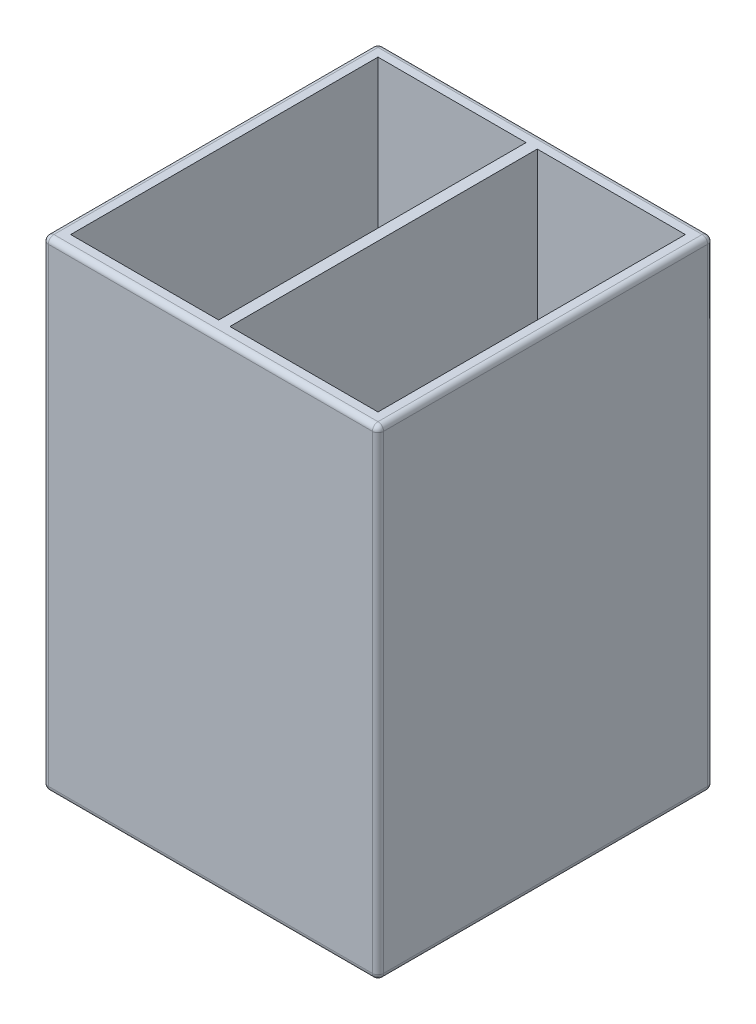
ISO-10303-21;
HEADER;
FILE_DESCRIPTION(('STEP AP214'),'2;1');
FILE_NAME('part.step','',(''),(''),'','','');
FILE_SCHEMA(('AUTOMOTIVE_DESIGN { 1 0 10303 214 1 1 1 1 }'));
ENDSEC;
DATA;
#1=APPLICATION_CONTEXT('core data for automotive mechanical design processes');
#2=APPLICATION_PROTOCOL_DEFINITION('international standard','automotive_design',2000,#1);
#3=PRODUCT_CONTEXT('',#1,'mechanical');
#4=PRODUCT('Part','Part','',(#3));
#5=PRODUCT_RELATED_PRODUCT_CATEGORY('part','',(#4));
#6=PRODUCT_DEFINITION_FORMATION('','',#4);
#7=PRODUCT_DEFINITION_CONTEXT('part definition',#1,'design');
#8=PRODUCT_DEFINITION('design','',#6,#7);
#9=PRODUCT_DEFINITION_SHAPE('','',#8);
#10=(LENGTH_UNIT() NAMED_UNIT(*) SI_UNIT(.MILLI.,.METRE.));
#11=(NAMED_UNIT(*) PLANE_ANGLE_UNIT() SI_UNIT($,.RADIAN.));
#12=(NAMED_UNIT(*) SI_UNIT($,.STERADIAN.) SOLID_ANGLE_UNIT());
#13=UNCERTAINTY_MEASURE_WITH_UNIT(LENGTH_MEASURE(1.E-05),#10,'distance_accuracy_value','');
#14=(GEOMETRIC_REPRESENTATION_CONTEXT(3) GLOBAL_UNCERTAINTY_ASSIGNED_CONTEXT((#13)) GLOBAL_UNIT_ASSIGNED_CONTEXT((#10,
#11,#12)) REPRESENTATION_CONTEXT('',''));
#15=CARTESIAN_POINT('',(0.,0.,0.));
#16=DIRECTION('',(0.,0.,1.));
#17=DIRECTION('',(1.,0.,0.));
#18=AXIS2_PLACEMENT_3D('',#15,#16,#17);
#19=CARTESIAN_POINT('',(-164.000159601933,109.22,-4.27528919135131));
#20=DIRECTION('',(1.,0.,0.));
#21=DIRECTION('',(0.,0.,-1.));
#22=AXIS2_PLACEMENT_3D('',#19,#20,#21);
#23=PLANE('',#22);
#24=DIRECTION('',(0.,0.,1.));
#25=VECTOR('',#24,1.);
#26=CARTESIAN_POINT('',(-164.000159601933,107.95,-4.27528919135131));
#27=LINE('',#26,#25);
#28=CARTESIAN_POINT('',(-164.000159601933,107.95,70.6547108086487));
#29=VERTEX_POINT('',#28);
#30=CARTESIAN_POINT('',(-164.000159601933,107.95,-3.00528919135131));
#31=VERTEX_POINT('',#30);
#32=EDGE_CURVE('E345',#29,#31,#27,.F.);
#33=ORIENTED_EDGE('',*,*,#32,.T.);
#34=DIRECTION('',(0.,-1.,0.));
#35=VECTOR('',#34,1.);
#36=CARTESIAN_POINT('',(-164.000159601933,109.22,-3.00528919135131));
#37=LINE('',#36,#35);
#38=CARTESIAN_POINT('',(-164.000159601933,1.26999999999999,-3.00528919135131));
#39=VERTEX_POINT('',#38);
#40=EDGE_CURVE('E348',#31,#39,#37,.T.);
#41=ORIENTED_EDGE('',*,*,#40,.T.);
#42=DIRECTION('',(0.,0.,1.));
#43=VECTOR('',#42,1.);
#44=CARTESIAN_POINT('',(-164.000159601933,1.26999999999999,-4.27528919135131));
#45=LINE('',#44,#43);
#46=CARTESIAN_POINT('',(-164.000159601933,1.26999999999999,70.6547108086487));
#47=VERTEX_POINT('',#46);
#48=EDGE_CURVE('E339',#39,#47,#45,.T.);
#49=ORIENTED_EDGE('',*,*,#48,.T.);
#50=DIRECTION('',(0.,-1.,0.));
#51=VECTOR('',#50,1.);
#52=CARTESIAN_POINT('',(-164.000159601933,109.22,70.6547108086487));
#53=LINE('',#52,#51);
#54=EDGE_CURVE('E342',#47,#29,#53,.F.);
#55=ORIENTED_EDGE('',*,*,#54,.T.);
#56=EDGE_LOOP('',(#33,#41,#49,#55));
#57=FACE_BOUND('',#56,.T.);
#58=ADVANCED_FACE('F39',(#57),#23,.F.);
#59=CARTESIAN_POINT('',(-164.000159601933,109.22,71.9247108086487));
#60=DIRECTION('',(0.,0.,-1.));
#61=DIRECTION('',(-1.,0.,0.));
#62=AXIS2_PLACEMENT_3D('',#59,#60,#61);
#63=PLANE('',#62);
#64=DIRECTION('',(0.,-1.,0.));
#65=VECTOR('',#64,1.);
#66=CARTESIAN_POINT('',(-89.0701596019327,109.22,71.9247108086487));
#67=LINE('',#66,#65);
#68=CARTESIAN_POINT('',(-89.0701596019327,1.26999999999999,71.9247108086487));
#69=VERTEX_POINT('',#68);
#70=CARTESIAN_POINT('',(-89.0701596019327,107.95,71.9247108086487));
#71=VERTEX_POINT('',#70);
#72=EDGE_CURVE('E332',#69,#71,#67,.F.);
#73=ORIENTED_EDGE('',*,*,#72,.T.);
#74=DIRECTION('',(1.,0.,0.));
#75=VECTOR('',#74,1.);
#76=CARTESIAN_POINT('',(-164.000159601933,107.95,71.9247108086487));
#77=LINE('',#76,#75);
#78=CARTESIAN_POINT('',(-162.730159601933,107.95,71.9247108086487));
#79=VERTEX_POINT('',#78);
#80=EDGE_CURVE('E335',#71,#79,#77,.F.);
#81=ORIENTED_EDGE('',*,*,#80,.T.);
#82=DIRECTION('',(0.,-1.,0.));
#83=VECTOR('',#82,1.);
#84=CARTESIAN_POINT('',(-162.730159601933,109.22,71.9247108086487));
#85=LINE('',#84,#83);
#86=CARTESIAN_POINT('',(-162.730159601933,1.26999999999999,71.9247108086487));
#87=VERTEX_POINT('',#86);
#88=EDGE_CURVE('E326',#79,#87,#85,.T.);
#89=ORIENTED_EDGE('',*,*,#88,.T.);
#90=DIRECTION('',(1.,0.,0.));
#91=VECTOR('',#90,1.);
#92=CARTESIAN_POINT('',(-164.000159601933,1.26999999999999,71.9247108086487));
#93=LINE('',#92,#91);
#94=EDGE_CURVE('E329',#87,#69,#93,.T.);
#95=ORIENTED_EDGE('',*,*,#94,.T.);
#96=EDGE_LOOP('',(#73,#81,#89,#95));
#97=FACE_BOUND('',#96,.T.);
#98=ADVANCED_FACE('F466',(#97),#63,.F.);
#99=CARTESIAN_POINT('',(-87.8001596019327,109.22,-4.27528919135131));
#100=DIRECTION('',(-1.,0.,0.));
#101=DIRECTION('',(0.,0.,1.));
#102=AXIS2_PLACEMENT_3D('',#99,#100,#101);
#103=PLANE('',#102);
#104=DIRECTION('',(0.,0.,-1.));
#105=VECTOR('',#104,1.);
#106=CARTESIAN_POINT('',(-87.8001596019327,1.26999999999999,-4.27528919135131));
#107=LINE('',#106,#105);
#108=CARTESIAN_POINT('',(-87.8001596019327,1.26999999999999,70.6547108086487));
#109=VERTEX_POINT('',#108);
#110=CARTESIAN_POINT('',(-87.8001596019327,1.26999999999999,-3.00528919135131));
#111=VERTEX_POINT('',#110);
#112=EDGE_CURVE('E290',#109,#111,#107,.T.);
#113=ORIENTED_EDGE('',*,*,#112,.T.);
#114=DIRECTION('',(0.,-1.,0.));
#115=VECTOR('',#114,1.);
#116=CARTESIAN_POINT('',(-87.8001596019327,109.22,-3.00528919135131));
#117=LINE('',#116,#115);
#118=CARTESIAN_POINT('',(-87.8001596019327,107.95,-3.00528919135131));
#119=VERTEX_POINT('',#118);
#120=EDGE_CURVE('E297',#111,#119,#117,.F.);
#121=ORIENTED_EDGE('',*,*,#120,.T.);
#122=DIRECTION('',(0.,0.,-1.));
#123=VECTOR('',#122,1.);
#124=CARTESIAN_POINT('',(-87.8001596019327,107.95,71.9247108086487));
#125=LINE('',#124,#123);
#126=CARTESIAN_POINT('',(-87.8001596019327,107.95,70.6547108086487));
#127=VERTEX_POINT('',#126);
#128=EDGE_CURVE('E293',#119,#127,#125,.F.);
#129=ORIENTED_EDGE('',*,*,#128,.T.);
#130=DIRECTION('',(0.,-1.,0.));
#131=VECTOR('',#130,1.);
#132=CARTESIAN_POINT('',(-87.8001596019327,109.22,70.6547108086487));
#133=LINE('',#132,#131);
#134=EDGE_CURVE('E287',#127,#109,#133,.T.);
#135=ORIENTED_EDGE('',*,*,#134,.T.);
#136=EDGE_LOOP('',(#113,#121,#129,#135));
#137=FACE_BOUND('',#136,.T.);
#138=ADVANCED_FACE('F535',(#137),#103,.F.);
#139=CARTESIAN_POINT('',(-164.000159601933,109.22,-4.27528919135131));
#140=DIRECTION('',(0.,0.,1.));
#141=DIRECTION('',(1.,0.,0.));
#142=AXIS2_PLACEMENT_3D('',#139,#140,#141);
#143=PLANE('',#142);
#144=DIRECTION('',(-1.,0.,0.));
#145=VECTOR('',#144,1.);
#146=CARTESIAN_POINT('',(-87.8001596019327,107.95,-4.27528919135131));
#147=LINE('',#146,#145);
#148=CARTESIAN_POINT('',(-162.730159601933,107.95,-4.27528919135131));
#149=VERTEX_POINT('',#148);
#150=CARTESIAN_POINT('',(-89.0701596019327,107.95,-4.27528919135131));
#151=VERTEX_POINT('',#150);
#152=EDGE_CURVE('E319',#149,#151,#147,.F.);
#153=ORIENTED_EDGE('',*,*,#152,.T.);
#154=DIRECTION('',(0.,-1.,0.));
#155=VECTOR('',#154,1.);
#156=CARTESIAN_POINT('',(-89.0701596019327,109.22,-4.27528919135131));
#157=LINE('',#156,#155);
#158=CARTESIAN_POINT('',(-89.0701596019327,1.26999999999999,-4.27528919135131));
#159=VERTEX_POINT('',#158);
#160=EDGE_CURVE('E322',#151,#159,#157,.T.);
#161=ORIENTED_EDGE('',*,*,#160,.T.);
#162=DIRECTION('',(-1.,0.,0.));
#163=VECTOR('',#162,1.);
#164=CARTESIAN_POINT('',(-164.000159601933,1.26999999999999,-4.27528919135131));
#165=LINE('',#164,#163);
#166=CARTESIAN_POINT('',(-162.730159601933,1.26999999999999,-4.27528919135131));
#167=VERTEX_POINT('',#166);
#168=EDGE_CURVE('E316',#159,#167,#165,.T.);
#169=ORIENTED_EDGE('',*,*,#168,.T.);
#170=DIRECTION('',(0.,-1.,0.));
#171=VECTOR('',#170,1.);
#172=CARTESIAN_POINT('',(-162.730159601933,109.22,-4.27528919135131));
#173=LINE('',#172,#171);
#174=EDGE_CURVE('E313',#167,#149,#173,.F.);
#175=ORIENTED_EDGE('',*,*,#174,.T.);
#176=EDGE_LOOP('',(#153,#161,#169,#175));
#177=FACE_BOUND('',#176,.T.);
#178=ADVANCED_FACE('F577',(#177),#143,.F.);
#179=CARTESIAN_POINT('',(0.,109.22,0.));
#180=DIRECTION('',(0.,1.,0.));
#181=DIRECTION('',(0.,0.,1.));
#182=AXIS2_PLACEMENT_3D('',#179,#180,#181);
#183=PLANE('',#182);
#184=DIRECTION('',(1.,0.,0.));
#185=VECTOR('',#184,1.);
#186=CARTESIAN_POINT('',(-87.8001596019327,109.22,70.6547108086487));
#187=LINE('',#186,#185);
#188=CARTESIAN_POINT('',(-162.730159601933,109.22,70.6547108086487));
#189=VERTEX_POINT('',#188);
#190=CARTESIAN_POINT('',(-89.0701596019327,109.22,70.6547108086487));
#191=VERTEX_POINT('',#190);
#192=EDGE_CURVE('E277',#189,#191,#187,.T.);
#193=ORIENTED_EDGE('',*,*,#192,.T.);
#194=DIRECTION('',(0.,0.,-1.));
#195=VECTOR('',#194,1.);
#196=CARTESIAN_POINT('',(-89.0701596019327,109.22,-4.27528919135131));
#197=LINE('',#196,#195);
#198=CARTESIAN_POINT('',(-89.0701596019327,109.22,-3.00528919135131));
#199=VERTEX_POINT('',#198);
#200=EDGE_CURVE('E283',#191,#199,#197,.T.);
#201=ORIENTED_EDGE('',*,*,#200,.T.);
#202=DIRECTION('',(-1.,0.,0.));
#203=VECTOR('',#202,1.);
#204=CARTESIAN_POINT('',(-164.000159601933,109.22,-3.00528919135131));
#205=LINE('',#204,#203);
#206=CARTESIAN_POINT('',(-162.730159601933,109.22,-3.00528919135131));
#207=VERTEX_POINT('',#206);
#208=EDGE_CURVE('E280',#199,#207,#205,.T.);
#209=ORIENTED_EDGE('',*,*,#208,.T.);
#210=DIRECTION('',(0.,0.,1.));
#211=VECTOR('',#210,1.);
#212=CARTESIAN_POINT('',(-162.730159601933,109.22,71.9247108086487));
#213=LINE('',#212,#211);
#214=EDGE_CURVE('E232',#207,#189,#213,.T.);
#215=ORIENTED_EDGE('',*,*,#214,.T.);
#216=EDGE_LOOP('',(#193,#201,#209,#215));
#217=FACE_BOUND('',#216,.T.);
#218=DIRECTION('',(0.,0.,1.));
#219=VECTOR('',#218,1.);
#220=CARTESIAN_POINT('',(-160.825159601933,109.22,-1.1002891913513));
#221=LINE('',#220,#219);
#222=CARTESIAN_POINT('',(-160.825159601933,109.22,-1.1002891913513));
#223=VERTEX_POINT('',#222);
#224=CARTESIAN_POINT('',(-160.825159601933,109.22,68.7497108086487));
#225=VERTEX_POINT('',#224);
#226=EDGE_CURVE('E189',#223,#225,#221,.T.);
#227=ORIENTED_EDGE('',*,*,#226,.F.);
#228=DIRECTION('',(1.,0.,0.));
#229=VECTOR('',#228,1.);
#230=CARTESIAN_POINT('',(-160.825159601933,109.22,-1.1002891913513));
#231=LINE('',#230,#229);
#232=CARTESIAN_POINT('',(-127.170159601933,109.22,-1.1002891913513));
#233=VERTEX_POINT('',#232);
#234=EDGE_CURVE('E209',#223,#233,#231,.T.);
#235=ORIENTED_EDGE('',*,*,#234,.T.);
#236=DIRECTION('',(0.,0.,1.));
#237=VECTOR('',#236,1.);
#238=CARTESIAN_POINT('',(-127.170159601933,109.22,-1.1002891913513));
#239=LINE('',#238,#237);
#240=CARTESIAN_POINT('',(-127.170159601933,109.22,68.7497108086487));
#241=VERTEX_POINT('',#240);
#242=EDGE_CURVE('E213',#233,#241,#239,.T.);
#243=ORIENTED_EDGE('',*,*,#242,.T.);
#244=DIRECTION('',(1.,0.,0.));
#245=VECTOR('',#244,1.);
#246=CARTESIAN_POINT('',(-160.825159601933,109.22,68.7497108086487));
#247=LINE('',#246,#245);
#248=EDGE_CURVE('E222',#225,#241,#247,.T.);
#249=ORIENTED_EDGE('',*,*,#248,.F.);
#250=EDGE_LOOP('',(#227,#235,#243,#249));
#251=FACE_BOUND('',#250,.T.);
#252=DIRECTION('',(0.,0.,1.));
#253=VECTOR('',#252,1.);
#254=CARTESIAN_POINT('',(-124.630159601933,109.22,-1.1002891913513));
#255=LINE('',#254,#253);
#256=CARTESIAN_POINT('',(-124.630159601933,109.22,-1.1002891913513));
#257=VERTEX_POINT('',#256);
#258=CARTESIAN_POINT('',(-124.630159601933,109.22,68.7497108086487));
#259=VERTEX_POINT('',#258);
#260=EDGE_CURVE('E223',#257,#259,#255,.T.);
#261=ORIENTED_EDGE('',*,*,#260,.F.);
#262=DIRECTION('',(1.,0.,0.));
#263=VECTOR('',#262,1.);
#264=CARTESIAN_POINT('',(-124.630159601933,109.22,-1.1002891913513));
#265=LINE('',#264,#263);
#266=CARTESIAN_POINT('',(-90.9751596019327,109.22,-1.1002891913513));
#267=VERTEX_POINT('',#266);
#268=EDGE_CURVE('E251',#257,#267,#265,.T.);
#269=ORIENTED_EDGE('',*,*,#268,.T.);
#270=DIRECTION('',(0.,0.,1.));
#271=VECTOR('',#270,1.);
#272=CARTESIAN_POINT('',(-90.9751596019327,109.22,-1.1002891913513));
#273=LINE('',#272,#271);
#274=CARTESIAN_POINT('',(-90.9751596019327,109.22,68.7497108086487));
#275=VERTEX_POINT('',#274);
#276=EDGE_CURVE('E255',#267,#275,#273,.T.);
#277=ORIENTED_EDGE('',*,*,#276,.T.);
#278=DIRECTION('',(1.,0.,0.));
#279=VECTOR('',#278,1.);
#280=CARTESIAN_POINT('',(-124.630159601933,109.22,68.7497108086487));
#281=LINE('',#280,#279);
#282=EDGE_CURVE('E260',#259,#275,#281,.T.);
#283=ORIENTED_EDGE('',*,*,#282,.F.);
#284=EDGE_LOOP('',(#261,#269,#277,#283));
#285=FACE_BOUND('',#284,.T.);
#286=ADVANCED_FACE('F574',(#217,#251,#285),#183,.T.);
#287=CARTESIAN_POINT('',(0.,0.,0.));
#288=DIRECTION('',(0.,1.,0.));
#289=DIRECTION('',(0.,0.,1.));
#290=AXIS2_PLACEMENT_3D('',#287,#288,#289);
#291=PLANE('',#290);
#292=DIRECTION('',(-1.,0.,0.));
#293=VECTOR('',#292,1.);
#294=CARTESIAN_POINT('',(0.,0.,-3.00528919135131));
#295=LINE('',#294,#293);
#296=CARTESIAN_POINT('',(-162.730159601933,0.,-3.00528919135131));
#297=VERTEX_POINT('',#296);
#298=CARTESIAN_POINT('',(-89.0701596019327,0.,-3.00528919135131));
#299=VERTEX_POINT('',#298);
#300=EDGE_CURVE('E306',#297,#299,#295,.F.);
#301=ORIENTED_EDGE('',*,*,#300,.T.);
#302=DIRECTION('',(0.,0.,-1.));
#303=VECTOR('',#302,1.);
#304=CARTESIAN_POINT('',(-89.0701596019327,0.,0.));
#305=LINE('',#304,#303);
#306=CARTESIAN_POINT('',(-89.0701596019327,0.,70.6547108086487));
#307=VERTEX_POINT('',#306);
#308=EDGE_CURVE('E309',#299,#307,#305,.F.);
#309=ORIENTED_EDGE('',*,*,#308,.T.);
#310=DIRECTION('',(1.,0.,0.));
#311=VECTOR('',#310,1.);
#312=CARTESIAN_POINT('',(0.,0.,70.6547108086487));
#313=LINE('',#312,#311);
#314=CARTESIAN_POINT('',(-162.730159601933,0.,70.6547108086487));
#315=VERTEX_POINT('',#314);
#316=EDGE_CURVE('E303',#307,#315,#313,.F.);
#317=ORIENTED_EDGE('',*,*,#316,.T.);
#318=DIRECTION('',(0.,0.,1.));
#319=VECTOR('',#318,1.);
#320=CARTESIAN_POINT('',(-162.730159601933,0.,0.));
#321=LINE('',#320,#319);
#322=EDGE_CURVE('E300',#315,#297,#321,.F.);
#323=ORIENTED_EDGE('',*,*,#322,.T.);
#324=EDGE_LOOP('',(#301,#309,#317,#323));
#325=FACE_BOUND('',#324,.T.);
#326=ADVANCED_FACE('F498',(#325),#291,.F.);
#327=CARTESIAN_POINT('',(-124.630159601933,7.62,-1.1002891913513));
#328=DIRECTION('',(-1.,0.,0.));
#329=DIRECTION('',(0.,0.,1.));
#330=AXIS2_PLACEMENT_3D('',#327,#328,#329);
#331=PLANE('',#330);
#332=DIRECTION('',(0.,1.,0.));
#333=VECTOR('',#332,1.);
#334=CARTESIAN_POINT('',(-124.630159601933,7.62,68.7497108086487));
#335=LINE('',#334,#333);
#336=CARTESIAN_POINT('',(-124.630159601933,8.89,68.7497108086487));
#337=VERTEX_POINT('',#336);
#338=EDGE_CURVE('E238',#337,#259,#335,.T.);
#339=ORIENTED_EDGE('',*,*,#338,.F.);
#340=DIRECTION('',(0.,0.,1.));
#341=VECTOR('',#340,1.);
#342=CARTESIAN_POINT('',(-124.630159601933,8.89,-1.1002891913513));
#343=LINE('',#342,#341);
#344=CARTESIAN_POINT('',(-124.630159601933,8.89,-1.1002891913513));
#345=VERTEX_POINT('',#344);
#346=EDGE_CURVE('E49',#337,#345,#343,.F.);
#347=ORIENTED_EDGE('',*,*,#346,.T.);
#348=DIRECTION('',(0.,1.,0.));
#349=VECTOR('',#348,1.);
#350=CARTESIAN_POINT('',(-124.630159601933,7.62,-1.1002891913513));
#351=LINE('',#350,#349);
#352=EDGE_CURVE('E248',#345,#257,#351,.T.);
#353=ORIENTED_EDGE('',*,*,#352,.T.);
#354=ORIENTED_EDGE('',*,*,#260,.T.);
#355=EDGE_LOOP('',(#339,#347,#353,#354));
#356=FACE_BOUND('',#355,.T.);
#357=ADVANCED_FACE('F583',(#356),#331,.F.);
#358=CARTESIAN_POINT('',(-124.630159601933,7.62,-1.1002891913513));
#359=DIRECTION('',(0.,0.,1.));
#360=DIRECTION('',(1.,0.,0.));
#361=AXIS2_PLACEMENT_3D('',#358,#359,#360);
#362=PLANE('',#361);
#363=ORIENTED_EDGE('',*,*,#352,.F.);
#364=CARTESIAN_POINT('',(-123.360159601933,8.89,-1.1002891913513));
#365=DIRECTION('',(0.,0.,1.));
#366=DIRECTION('',(1.,0.,0.));
#367=AXIS2_PLACEMENT_3D('',#364,#365,#366);
#368=CIRCLE('',#367,1.27);
#369=CARTESIAN_POINT('',(-123.360159601933,7.62,-1.1002891913513));
#370=VERTEX_POINT('',#369);
#371=EDGE_CURVE('E11',#345,#370,#368,.T.);
#372=ORIENTED_EDGE('',*,*,#371,.T.);
#373=DIRECTION('',(1.,0.,0.));
#374=VECTOR('',#373,1.);
#375=CARTESIAN_POINT('',(-124.630159601933,7.62,-1.1002891913513));
#376=LINE('',#375,#374);
#377=CARTESIAN_POINT('',(-90.9751596019327,7.62,-1.1002891913513));
#378=VERTEX_POINT('',#377);
#379=EDGE_CURVE('E241',#370,#378,#376,.T.);
#380=ORIENTED_EDGE('',*,*,#379,.T.);
#381=DIRECTION('',(0.,1.,0.));
#382=VECTOR('',#381,1.);
#383=CARTESIAN_POINT('',(-90.9751596019327,7.62,-1.1002891913513));
#384=LINE('',#383,#382);
#385=EDGE_CURVE('E245',#378,#267,#384,.T.);
#386=ORIENTED_EDGE('',*,*,#385,.T.);
#387=ORIENTED_EDGE('',*,*,#268,.F.);
#388=EDGE_LOOP('',(#363,#372,#380,#386,#387));
#389=FACE_BOUND('',#388,.T.);
#390=ADVANCED_FACE('F586',(#389),#362,.T.);
#391=CARTESIAN_POINT('',(-90.9751596019327,7.62,-1.1002891913513));
#392=DIRECTION('',(-1.,0.,0.));
#393=DIRECTION('',(0.,0.,1.));
#394=AXIS2_PLACEMENT_3D('',#391,#392,#393);
#395=PLANE('',#394);
#396=ORIENTED_EDGE('',*,*,#276,.F.);
#397=ORIENTED_EDGE('',*,*,#385,.F.);
#398=DIRECTION('',(0.,0.,1.));
#399=VECTOR('',#398,1.);
#400=CARTESIAN_POINT('',(-90.9751596019327,7.62,-1.1002891913513));
#401=LINE('',#400,#399);
#402=CARTESIAN_POINT('',(-90.9751596019327,7.62,68.7497108086487));
#403=VERTEX_POINT('',#402);
#404=EDGE_CURVE('E269',#378,#403,#401,.T.);
#405=ORIENTED_EDGE('',*,*,#404,.T.);
#406=DIRECTION('',(0.,1.,0.));
#407=VECTOR('',#406,1.);
#408=CARTESIAN_POINT('',(-90.9751596019327,7.62,68.7497108086487));
#409=LINE('',#408,#407);
#410=EDGE_CURVE('E242',#403,#275,#409,.T.);
#411=ORIENTED_EDGE('',*,*,#410,.T.);
#412=EDGE_LOOP('',(#396,#397,#405,#411));
#413=FACE_BOUND('',#412,.T.);
#414=ADVANCED_FACE('F592',(#413),#395,.T.);
#415=CARTESIAN_POINT('',(-124.630159601933,7.62,68.7497108086487));
#416=DIRECTION('',(0.,0.,1.));
#417=DIRECTION('',(1.,0.,0.));
#418=AXIS2_PLACEMENT_3D('',#415,#416,#417);
#419=PLANE('',#418);
#420=DIRECTION('',(1.,0.,0.));
#421=VECTOR('',#420,1.);
#422=CARTESIAN_POINT('',(-124.630159601933,7.62,68.7497108086487));
#423=LINE('',#422,#421);
#424=CARTESIAN_POINT('',(-123.360159601933,7.62,68.7497108086487));
#425=VERTEX_POINT('',#424);
#426=EDGE_CURVE('E256',#425,#403,#423,.T.);
#427=ORIENTED_EDGE('',*,*,#426,.F.);
#428=CARTESIAN_POINT('',(-123.360159601933,8.89,68.7497108086487));
#429=DIRECTION('',(0.,0.,1.));
#430=DIRECTION('',(1.,0.,0.));
#431=AXIS2_PLACEMENT_3D('',#428,#429,#430);
#432=CIRCLE('',#431,1.27);
#433=EDGE_CURVE('E64',#425,#337,#432,.F.);
#434=ORIENTED_EDGE('',*,*,#433,.T.);
#435=ORIENTED_EDGE('',*,*,#338,.T.);
#436=ORIENTED_EDGE('',*,*,#282,.T.);
#437=ORIENTED_EDGE('',*,*,#410,.F.);
#438=EDGE_LOOP('',(#427,#434,#435,#436,#437));
#439=FACE_BOUND('',#438,.T.);
#440=ADVANCED_FACE('F594',(#439),#419,.F.);
#441=CARTESIAN_POINT('',(0.,7.62,0.));
#442=DIRECTION('',(0.,1.,0.));
#443=DIRECTION('',(0.,0.,1.));
#444=AXIS2_PLACEMENT_3D('',#441,#442,#443);
#445=PLANE('',#444);
#446=ORIENTED_EDGE('',*,*,#379,.F.);
#447=DIRECTION('',(0.,0.,1.));
#448=VECTOR('',#447,1.);
#449=CARTESIAN_POINT('',(-123.360159601933,7.62,0.));
#450=LINE('',#449,#448);
#451=EDGE_CURVE('E352',#370,#425,#450,.T.);
#452=ORIENTED_EDGE('',*,*,#451,.T.);
#453=ORIENTED_EDGE('',*,*,#426,.T.);
#454=ORIENTED_EDGE('',*,*,#404,.F.);
#455=EDGE_LOOP('',(#446,#452,#453,#454));
#456=FACE_BOUND('',#455,.T.);
#457=ADVANCED_FACE('F596',(#456),#445,.T.);
#458=CARTESIAN_POINT('',(-160.825159601933,7.62,-1.1002891913513));
#459=DIRECTION('',(-1.,0.,0.));
#460=DIRECTION('',(0.,0.,1.));
#461=AXIS2_PLACEMENT_3D('',#458,#459,#460);
#462=PLANE('',#461);
#463=ORIENTED_EDGE('',*,*,#226,.T.);
#464=DIRECTION('',(0.,1.,0.));
#465=VECTOR('',#464,1.);
#466=CARTESIAN_POINT('',(-160.825159601933,7.62,68.7497108086487));
#467=LINE('',#466,#465);
#468=CARTESIAN_POINT('',(-160.825159601933,7.62,68.7497108086487));
#469=VERTEX_POINT('',#468);
#470=EDGE_CURVE('E183',#469,#225,#467,.T.);
#471=ORIENTED_EDGE('',*,*,#470,.F.);
#472=DIRECTION('',(0.,0.,1.));
#473=VECTOR('',#472,1.);
#474=CARTESIAN_POINT('',(-160.825159601933,7.62,-1.1002891913513));
#475=LINE('',#474,#473);
#476=CARTESIAN_POINT('',(-160.825159601933,7.62,-1.1002891913513));
#477=VERTEX_POINT('',#476);
#478=EDGE_CURVE('E187',#477,#469,#475,.T.);
#479=ORIENTED_EDGE('',*,*,#478,.F.);
#480=DIRECTION('',(0.,1.,0.));
#481=VECTOR('',#480,1.);
#482=CARTESIAN_POINT('',(-160.825159601933,7.62,-1.1002891913513));
#483=LINE('',#482,#481);
#484=EDGE_CURVE('E229',#477,#223,#483,.T.);
#485=ORIENTED_EDGE('',*,*,#484,.T.);
#486=EDGE_LOOP('',(#463,#471,#479,#485));
#487=FACE_BOUND('',#486,.T.);
#488=ADVANCED_FACE('F185',(#487),#462,.F.);
#489=CARTESIAN_POINT('',(-160.825159601933,7.62,-1.1002891913513));
#490=DIRECTION('',(0.,0.,1.));
#491=DIRECTION('',(1.,0.,0.));
#492=AXIS2_PLACEMENT_3D('',#489,#490,#491);
#493=PLANE('',#492);
#494=ORIENTED_EDGE('',*,*,#234,.F.);
#495=ORIENTED_EDGE('',*,*,#484,.F.);
#496=DIRECTION('',(1.,0.,0.));
#497=VECTOR('',#496,1.);
#498=CARTESIAN_POINT('',(-160.825159601933,7.62,-1.1002891913513));
#499=LINE('',#498,#497);
#500=CARTESIAN_POINT('',(-127.170159601933,7.62,-1.1002891913513));
#501=VERTEX_POINT('',#500);
#502=EDGE_CURVE('E195',#477,#501,#499,.T.);
#503=ORIENTED_EDGE('',*,*,#502,.T.);
#504=DIRECTION('',(0.,1.,0.));
#505=VECTOR('',#504,1.);
#506=CARTESIAN_POINT('',(-127.170159601933,7.62,-1.1002891913513));
#507=LINE('',#506,#505);
#508=EDGE_CURVE('E233',#501,#233,#507,.T.);
#509=ORIENTED_EDGE('',*,*,#508,.T.);
#510=EDGE_LOOP('',(#494,#495,#503,#509));
#511=FACE_BOUND('',#510,.T.);
#512=ADVANCED_FACE('F654',(#511),#493,.T.);
#513=CARTESIAN_POINT('',(-127.170159601933,7.62,-1.1002891913513));
#514=DIRECTION('',(-1.,0.,0.));
#515=DIRECTION('',(0.,0.,1.));
#516=AXIS2_PLACEMENT_3D('',#513,#514,#515);
#517=PLANE('',#516);
#518=ORIENTED_EDGE('',*,*,#242,.F.);
#519=ORIENTED_EDGE('',*,*,#508,.F.);
#520=DIRECTION('',(0.,0.,1.));
#521=VECTOR('',#520,1.);
#522=CARTESIAN_POINT('',(-127.170159601933,7.62,-1.1002891913513));
#523=LINE('',#522,#521);
#524=CARTESIAN_POINT('',(-127.170159601933,7.62,68.7497108086487));
#525=VERTEX_POINT('',#524);
#526=EDGE_CURVE('E204',#501,#525,#523,.T.);
#527=ORIENTED_EDGE('',*,*,#526,.T.);
#528=DIRECTION('',(0.,1.,0.));
#529=VECTOR('',#528,1.);
#530=CARTESIAN_POINT('',(-127.170159601933,7.62,68.7497108086487));
#531=LINE('',#530,#529);
#532=EDGE_CURVE('E194',#525,#241,#531,.T.);
#533=ORIENTED_EDGE('',*,*,#532,.T.);
#534=EDGE_LOOP('',(#518,#519,#527,#533));
#535=FACE_BOUND('',#534,.T.);
#536=ADVANCED_FACE('F663',(#535),#517,.T.);
#537=CARTESIAN_POINT('',(-160.825159601933,7.62,68.7497108086487));
#538=DIRECTION('',(0.,0.,1.));
#539=DIRECTION('',(1.,0.,0.));
#540=AXIS2_PLACEMENT_3D('',#537,#538,#539);
#541=PLANE('',#540);
#542=ORIENTED_EDGE('',*,*,#248,.T.);
#543=ORIENTED_EDGE('',*,*,#532,.F.);
#544=DIRECTION('',(1.,0.,0.));
#545=VECTOR('',#544,1.);
#546=CARTESIAN_POINT('',(-160.825159601933,7.62,68.7497108086487));
#547=LINE('',#546,#545);
#548=EDGE_CURVE('E199',#469,#525,#547,.T.);
#549=ORIENTED_EDGE('',*,*,#548,.F.);
#550=ORIENTED_EDGE('',*,*,#470,.T.);
#551=EDGE_LOOP('',(#542,#543,#549,#550));
#552=FACE_BOUND('',#551,.T.);
#553=ADVANCED_FACE('F200',(#552),#541,.F.);
#554=CARTESIAN_POINT('',(0.,7.62,0.));
#555=DIRECTION('',(0.,1.,0.));
#556=DIRECTION('',(0.,0.,1.));
#557=AXIS2_PLACEMENT_3D('',#554,#555,#556);
#558=PLANE('',#557);
#559=ORIENTED_EDGE('',*,*,#478,.T.);
#560=ORIENTED_EDGE('',*,*,#548,.T.);
#561=ORIENTED_EDGE('',*,*,#526,.F.);
#562=ORIENTED_EDGE('',*,*,#502,.F.);
#563=EDGE_LOOP('',(#559,#560,#561,#562));
#564=FACE_BOUND('',#563,.T.);
#565=ADVANCED_FACE('F207',(#564),#558,.T.);
#566=CARTESIAN_POINT('',(-162.730159601933,1.26999999999999,-4.27528919135131));
#567=DIRECTION('',(0.,0.,1.));
#568=DIRECTION('',(1.,0.,0.));
#569=AXIS2_PLACEMENT_3D('',#566,#567,#568);
#570=CYLINDRICAL_SURFACE('',#569,1.27);
#571=CARTESIAN_POINT('',(-162.730159601933,1.26999999999999,70.6547108086487));
#572=DIRECTION('',(0.,0.,1.));
#573=DIRECTION('',(1.,0.,0.));
#574=AXIS2_PLACEMENT_3D('',#571,#572,#573);
#575=CIRCLE('',#574,1.27);
#576=EDGE_CURVE('E43',#47,#315,#575,.T.);
#577=ORIENTED_EDGE('',*,*,#576,.F.);
#578=ORIENTED_EDGE('',*,*,#48,.F.);
#579=CARTESIAN_POINT('',(-162.730159601933,1.27,-3.00528919135131));
#580=DIRECTION('',(0.,0.,-1.));
#581=DIRECTION('',(-1.,0.,0.));
#582=AXIS2_PLACEMENT_3D('',#579,#580,#581);
#583=CIRCLE('',#582,1.27);
#584=EDGE_CURVE('E441',#297,#39,#583,.T.);
#585=ORIENTED_EDGE('',*,*,#584,.F.);
#586=ORIENTED_EDGE('',*,*,#322,.F.);
#587=EDGE_LOOP('',(#577,#578,#585,#586));
#588=FACE_BOUND('',#587,.T.);
#589=ADVANCED_FACE('F689',(#588),#570,.T.);
#590=CARTESIAN_POINT('',(-162.730159601933,1.27,70.6547108086487));
#591=DIRECTION('',(0.,-1.,0.));
#592=DIRECTION('',(0.,0.,-1.));
#593=AXIS2_PLACEMENT_3D('',#590,#591,#592);
#594=SPHERICAL_SURFACE('',#593,1.27);
#595=CARTESIAN_POINT('',(-162.730159601933,1.26999999999999,70.6547108086487));
#596=DIRECTION('',(0.,-1.,0.));
#597=DIRECTION('',(0.,0.,-1.));
#598=AXIS2_PLACEMENT_3D('',#595,#596,#597);
#599=CIRCLE('',#598,1.27);
#600=EDGE_CURVE('E434',#47,#87,#599,.F.);
#601=ORIENTED_EDGE('',*,*,#600,.F.);
#602=ORIENTED_EDGE('',*,*,#576,.T.);
#603=CARTESIAN_POINT('',(-162.730159601933,1.27,70.6547108086487));
#604=DIRECTION('',(-1.,0.,0.));
#605=DIRECTION('',(0.,0.,1.));
#606=AXIS2_PLACEMENT_3D('',#603,#604,#605);
#607=CIRCLE('',#606,1.27);
#608=EDGE_CURVE('E438',#87,#315,#607,.F.);
#609=ORIENTED_EDGE('',*,*,#608,.F.);
#610=EDGE_LOOP('',(#601,#602,#609));
#611=FACE_BOUND('',#610,.T.);
#612=ADVANCED_FACE('F455',(#611),#594,.T.);
#613=CARTESIAN_POINT('',(-162.730159601933,1.27,-3.00528919135131));
#614=DIRECTION('',(-1.,0.,0.));
#615=DIRECTION('',(0.,-1.,0.));
#616=AXIS2_PLACEMENT_3D('',#613,#614,#615);
#617=SPHERICAL_SURFACE('',#616,1.27);
#618=CARTESIAN_POINT('',(-162.730159601933,1.26999999999999,-3.00528919135131));
#619=DIRECTION('',(-1.,0.,0.));
#620=DIRECTION('',(0.,0.,1.));
#621=AXIS2_PLACEMENT_3D('',#618,#619,#620);
#622=CIRCLE('',#621,1.27);
#623=EDGE_CURVE('E427',#297,#167,#622,.F.);
#624=ORIENTED_EDGE('',*,*,#623,.F.);
#625=ORIENTED_EDGE('',*,*,#584,.T.);
#626=CARTESIAN_POINT('',(-162.730159601933,1.26999999999999,-3.00528919135131));
#627=DIRECTION('',(0.,-1.,0.));
#628=DIRECTION('',(0.,0.,-1.));
#629=AXIS2_PLACEMENT_3D('',#626,#627,#628);
#630=CIRCLE('',#629,1.27);
#631=EDGE_CURVE('E431',#167,#39,#630,.F.);
#632=ORIENTED_EDGE('',*,*,#631,.F.);
#633=EDGE_LOOP('',(#624,#625,#632));
#634=FACE_BOUND('',#633,.T.);
#635=ADVANCED_FACE('F490',(#634),#617,.T.);
#636=CARTESIAN_POINT('',(-164.000159601933,1.26999999999999,70.6547108086487));
#637=DIRECTION('',(1.,0.,0.));
#638=DIRECTION('',(0.,0.,-1.));
#639=AXIS2_PLACEMENT_3D('',#636,#637,#638);
#640=CYLINDRICAL_SURFACE('',#639,1.27);
#641=ORIENTED_EDGE('',*,*,#608,.T.);
#642=ORIENTED_EDGE('',*,*,#316,.F.);
#643=CARTESIAN_POINT('',(-89.0701596019327,1.26999999999999,70.6547108086487));
#644=DIRECTION('',(1.,0.,0.));
#645=DIRECTION('',(0.,0.,-1.));
#646=AXIS2_PLACEMENT_3D('',#643,#644,#645);
#647=CIRCLE('',#646,1.27);
#648=EDGE_CURVE('E420',#69,#307,#647,.T.);
#649=ORIENTED_EDGE('',*,*,#648,.F.);
#650=ORIENTED_EDGE('',*,*,#94,.F.);
#651=EDGE_LOOP('',(#641,#642,#649,#650));
#652=FACE_BOUND('',#651,.T.);
#653=ADVANCED_FACE('F462',(#652),#640,.T.);
#654=CARTESIAN_POINT('',(-162.730159601933,109.22,70.6547108086487));
#655=DIRECTION('',(0.,-1.,0.));
#656=DIRECTION('',(0.,0.,-1.));
#657=AXIS2_PLACEMENT_3D('',#654,#655,#656);
#658=CYLINDRICAL_SURFACE('',#657,1.27);
#659=ORIENTED_EDGE('',*,*,#600,.T.);
#660=ORIENTED_EDGE('',*,*,#88,.F.);
#661=CARTESIAN_POINT('',(-162.730159601933,107.95,70.6547108086487));
#662=DIRECTION('',(0.,1.,0.));
#663=DIRECTION('',(0.,0.,1.));
#664=AXIS2_PLACEMENT_3D('',#661,#662,#663);
#665=CIRCLE('',#664,1.27);
#666=EDGE_CURVE('E416',#29,#79,#665,.T.);
#667=ORIENTED_EDGE('',*,*,#666,.F.);
#668=ORIENTED_EDGE('',*,*,#54,.F.);
#669=EDGE_LOOP('',(#659,#660,#667,#668));
#670=FACE_BOUND('',#669,.T.);
#671=ADVANCED_FACE('F472',(#670),#658,.T.);
#672=CARTESIAN_POINT('',(-162.730159601933,107.95,0.));
#673=DIRECTION('',(0.,0.,-1.));
#674=DIRECTION('',(-1.,0.,0.));
#675=AXIS2_PLACEMENT_3D('',#672,#673,#674);
#676=CYLINDRICAL_SURFACE('',#675,1.27);
#677=CARTESIAN_POINT('',(-162.730159601933,107.95,-3.00528919135131));
#678=DIRECTION('',(0.,0.,-1.));
#679=DIRECTION('',(-1.,0.,0.));
#680=AXIS2_PLACEMENT_3D('',#677,#678,#679);
#681=CIRCLE('',#680,1.27);
#682=EDGE_CURVE('E408',#31,#207,#681,.T.);
#683=ORIENTED_EDGE('',*,*,#682,.F.);
#684=ORIENTED_EDGE('',*,*,#32,.F.);
#685=CARTESIAN_POINT('',(-162.730159601933,107.95,70.6547108086487));
#686=DIRECTION('',(0.,0.,1.));
#687=DIRECTION('',(1.,0.,0.));
#688=AXIS2_PLACEMENT_3D('',#685,#686,#687);
#689=CIRCLE('',#688,1.27);
#690=EDGE_CURVE('E412',#189,#29,#689,.T.);
#691=ORIENTED_EDGE('',*,*,#690,.F.);
#692=ORIENTED_EDGE('',*,*,#214,.F.);
#693=EDGE_LOOP('',(#683,#684,#691,#692));
#694=FACE_BOUND('',#693,.T.);
#695=ADVANCED_FACE('F479',(#694),#676,.T.);
#696=CARTESIAN_POINT('',(-162.730159601933,109.22,-3.00528919135131));
#697=DIRECTION('',(0.,-1.,0.));
#698=DIRECTION('',(0.,0.,-1.));
#699=AXIS2_PLACEMENT_3D('',#696,#697,#698);
#700=CYLINDRICAL_SURFACE('',#699,1.27);
#701=ORIENTED_EDGE('',*,*,#631,.T.);
#702=ORIENTED_EDGE('',*,*,#40,.F.);
#703=CARTESIAN_POINT('',(-162.730159601933,107.95,-3.00528919135131));
#704=DIRECTION('',(0.,1.,0.));
#705=DIRECTION('',(0.,0.,1.));
#706=AXIS2_PLACEMENT_3D('',#703,#704,#705);
#707=CIRCLE('',#706,1.27);
#708=EDGE_CURVE('E404',#149,#31,#707,.T.);
#709=ORIENTED_EDGE('',*,*,#708,.F.);
#710=ORIENTED_EDGE('',*,*,#174,.F.);
#711=EDGE_LOOP('',(#701,#702,#709,#710));
#712=FACE_BOUND('',#711,.T.);
#713=ADVANCED_FACE('F489',(#712),#700,.T.);
#714=CARTESIAN_POINT('',(-164.000159601933,1.26999999999999,-3.00528919135131));
#715=DIRECTION('',(-1.,0.,0.));
#716=DIRECTION('',(0.,0.,1.));
#717=AXIS2_PLACEMENT_3D('',#714,#715,#716);
#718=CYLINDRICAL_SURFACE('',#717,1.27);
#719=ORIENTED_EDGE('',*,*,#623,.T.);
#720=ORIENTED_EDGE('',*,*,#168,.F.);
#721=CARTESIAN_POINT('',(-89.0701596019327,1.27,-3.00528919135131));
#722=DIRECTION('',(1.,0.,0.));
#723=DIRECTION('',(0.,0.,-1.));
#724=AXIS2_PLACEMENT_3D('',#721,#722,#723);
#725=CIRCLE('',#724,1.27);
#726=EDGE_CURVE('E400',#299,#159,#725,.T.);
#727=ORIENTED_EDGE('',*,*,#726,.F.);
#728=ORIENTED_EDGE('',*,*,#300,.F.);
#729=EDGE_LOOP('',(#719,#720,#727,#728));
#730=FACE_BOUND('',#729,.T.);
#731=ADVANCED_FACE('F495',(#730),#718,.T.);
#732=CARTESIAN_POINT('',(-89.0701596019327,1.26999999999999,-4.27528919135131));
#733=DIRECTION('',(0.,0.,-1.));
#734=DIRECTION('',(-1.,0.,0.));
#735=AXIS2_PLACEMENT_3D('',#732,#733,#734);
#736=CYLINDRICAL_SURFACE('',#735,1.27);
#737=CARTESIAN_POINT('',(-89.0701596019327,1.27,70.6547108086487));
#738=DIRECTION('',(0.,0.,1.));
#739=DIRECTION('',(1.,0.,0.));
#740=AXIS2_PLACEMENT_3D('',#737,#738,#739);
#741=CIRCLE('',#740,1.27);
#742=EDGE_CURVE('E423',#307,#109,#741,.T.);
#743=ORIENTED_EDGE('',*,*,#742,.F.);
#744=ORIENTED_EDGE('',*,*,#308,.F.);
#745=CARTESIAN_POINT('',(-89.0701596019327,1.26999999999999,-3.00528919135131));
#746=DIRECTION('',(0.,0.,-1.));
#747=DIRECTION('',(-1.,0.,0.));
#748=AXIS2_PLACEMENT_3D('',#745,#746,#747);
#749=CIRCLE('',#748,1.27);
#750=EDGE_CURVE('E396',#111,#299,#749,.T.);
#751=ORIENTED_EDGE('',*,*,#750,.F.);
#752=ORIENTED_EDGE('',*,*,#112,.F.);
#753=EDGE_LOOP('',(#743,#744,#751,#752));
#754=FACE_BOUND('',#753,.T.);
#755=ADVANCED_FACE('F502',(#754),#736,.T.);
#756=CARTESIAN_POINT('',(-89.0701596019327,1.27,70.6547108086487));
#757=DIRECTION('',(0.,-1.,0.));
#758=DIRECTION('',(0.,0.,-1.));
#759=AXIS2_PLACEMENT_3D('',#756,#757,#758);
#760=SPHERICAL_SURFACE('',#759,1.27);
#761=ORIENTED_EDGE('',*,*,#648,.T.);
#762=ORIENTED_EDGE('',*,*,#742,.T.);
#763=CARTESIAN_POINT('',(-89.0701596019327,1.26999999999999,70.6547108086487));
#764=DIRECTION('',(0.,-1.,0.));
#765=DIRECTION('',(0.,0.,-1.));
#766=AXIS2_PLACEMENT_3D('',#763,#764,#765);
#767=CIRCLE('',#766,1.27);
#768=EDGE_CURVE('E392',#69,#109,#767,.F.);
#769=ORIENTED_EDGE('',*,*,#768,.F.);
#770=EDGE_LOOP('',(#761,#762,#769));
#771=FACE_BOUND('',#770,.T.);
#772=ADVANCED_FACE('F506',(#771),#760,.T.);
#773=CARTESIAN_POINT('',(-162.730159601933,107.95,70.6547108086487));
#774=DIRECTION('',(-1.,0.,0.));
#775=DIRECTION('',(0.,0.,1.));
#776=AXIS2_PLACEMENT_3D('',#773,#774,#775);
#777=SPHERICAL_SURFACE('',#776,1.27);
#778=ORIENTED_EDGE('',*,*,#690,.T.);
#779=ORIENTED_EDGE('',*,*,#666,.T.);
#780=CARTESIAN_POINT('',(-162.730159601933,107.95,70.6547108086487));
#781=DIRECTION('',(-1.,0.,0.));
#782=DIRECTION('',(0.,0.,1.));
#783=AXIS2_PLACEMENT_3D('',#780,#781,#782);
#784=CIRCLE('',#783,1.27);
#785=EDGE_CURVE('E389',#189,#79,#784,.F.);
#786=ORIENTED_EDGE('',*,*,#785,.F.);
#787=EDGE_LOOP('',(#778,#779,#786));
#788=FACE_BOUND('',#787,.T.);
#789=ADVANCED_FACE('F520',(#788),#777,.T.);
#790=CARTESIAN_POINT('',(-162.730159601933,107.95,-3.00528919135131));
#791=DIRECTION('',(-1.,0.,0.));
#792=DIRECTION('',(0.,0.,1.));
#793=AXIS2_PLACEMENT_3D('',#790,#791,#792);
#794=SPHERICAL_SURFACE('',#793,1.27);
#795=ORIENTED_EDGE('',*,*,#708,.T.);
#796=ORIENTED_EDGE('',*,*,#682,.T.);
#797=CARTESIAN_POINT('',(-162.730159601933,107.95,-3.00528919135131));
#798=DIRECTION('',(-1.,0.,0.));
#799=DIRECTION('',(0.,0.,1.));
#800=AXIS2_PLACEMENT_3D('',#797,#798,#799);
#801=CIRCLE('',#800,1.27);
#802=EDGE_CURVE('E385',#149,#207,#801,.F.);
#803=ORIENTED_EDGE('',*,*,#802,.F.);
#804=EDGE_LOOP('',(#795,#796,#803));
#805=FACE_BOUND('',#804,.T.);
#806=ADVANCED_FACE('F485',(#805),#794,.T.);
#807=CARTESIAN_POINT('',(-89.0701596019327,1.27,-3.00528919135131));
#808=DIRECTION('',(0.,-1.,0.));
#809=DIRECTION('',(0.,0.,-1.));
#810=AXIS2_PLACEMENT_3D('',#807,#808,#809);
#811=SPHERICAL_SURFACE('',#810,1.27);
#812=ORIENTED_EDGE('',*,*,#750,.T.);
#813=ORIENTED_EDGE('',*,*,#726,.T.);
#814=CARTESIAN_POINT('',(-89.0701596019327,1.26999999999999,-3.00528919135131));
#815=DIRECTION('',(0.,-1.,0.));
#816=DIRECTION('',(0.,0.,-1.));
#817=AXIS2_PLACEMENT_3D('',#814,#815,#816);
#818=CIRCLE('',#817,1.27);
#819=EDGE_CURVE('E382',#111,#159,#818,.F.);
#820=ORIENTED_EDGE('',*,*,#819,.F.);
#821=EDGE_LOOP('',(#812,#813,#820));
#822=FACE_BOUND('',#821,.T.);
#823=ADVANCED_FACE('F527',(#822),#811,.T.);
#824=CARTESIAN_POINT('',(-89.0701596019327,109.22,70.6547108086487));
#825=DIRECTION('',(0.,-1.,0.));
#826=DIRECTION('',(0.,0.,-1.));
#827=AXIS2_PLACEMENT_3D('',#824,#825,#826);
#828=CYLINDRICAL_SURFACE('',#827,1.27);
#829=ORIENTED_EDGE('',*,*,#768,.T.);
#830=ORIENTED_EDGE('',*,*,#134,.F.);
#831=CARTESIAN_POINT('',(-89.0701596019327,107.95,70.6547108086487));
#832=DIRECTION('',(0.,1.,0.));
#833=DIRECTION('',(0.,0.,1.));
#834=AXIS2_PLACEMENT_3D('',#831,#832,#833);
#835=CIRCLE('',#834,1.27);
#836=EDGE_CURVE('E378',#71,#127,#835,.T.);
#837=ORIENTED_EDGE('',*,*,#836,.F.);
#838=ORIENTED_EDGE('',*,*,#72,.F.);
#839=EDGE_LOOP('',(#829,#830,#837,#838));
#840=FACE_BOUND('',#839,.T.);
#841=ADVANCED_FACE('F509',(#840),#828,.T.);
#842=CARTESIAN_POINT('',(0.,107.95,70.6547108086487));
#843=DIRECTION('',(-1.,0.,0.));
#844=DIRECTION('',(0.,0.,1.));
#845=AXIS2_PLACEMENT_3D('',#842,#843,#844);
#846=CYLINDRICAL_SURFACE('',#845,1.27);
#847=ORIENTED_EDGE('',*,*,#785,.T.);
#848=ORIENTED_EDGE('',*,*,#80,.F.);
#849=CARTESIAN_POINT('',(-89.0701596019327,107.95,70.6547108086487));
#850=DIRECTION('',(1.,0.,0.));
#851=DIRECTION('',(0.,0.,-1.));
#852=AXIS2_PLACEMENT_3D('',#849,#850,#851);
#853=CIRCLE('',#852,1.27);
#854=EDGE_CURVE('E374',#191,#71,#853,.T.);
#855=ORIENTED_EDGE('',*,*,#854,.F.);
#856=ORIENTED_EDGE('',*,*,#192,.F.);
#857=EDGE_LOOP('',(#847,#848,#855,#856));
#858=FACE_BOUND('',#857,.T.);
#859=ADVANCED_FACE('F518',(#858),#846,.T.);
#860=CARTESIAN_POINT('',(0.,107.95,-3.00528919135131));
#861=DIRECTION('',(1.,0.,0.));
#862=DIRECTION('',(0.,0.,-1.));
#863=AXIS2_PLACEMENT_3D('',#860,#861,#862);
#864=CYLINDRICAL_SURFACE('',#863,1.27);
#865=ORIENTED_EDGE('',*,*,#802,.T.);
#866=ORIENTED_EDGE('',*,*,#208,.F.);
#867=CARTESIAN_POINT('',(-89.0701596019327,107.95,-3.00528919135131));
#868=DIRECTION('',(1.,0.,0.));
#869=DIRECTION('',(0.,0.,-1.));
#870=AXIS2_PLACEMENT_3D('',#867,#868,#869);
#871=CIRCLE('',#870,1.27);
#872=EDGE_CURVE('E370',#151,#199,#871,.T.);
#873=ORIENTED_EDGE('',*,*,#872,.F.);
#874=ORIENTED_EDGE('',*,*,#152,.F.);
#875=EDGE_LOOP('',(#865,#866,#873,#874));
#876=FACE_BOUND('',#875,.T.);
#877=ADVANCED_FACE('F552',(#876),#864,.T.);
#878=CARTESIAN_POINT('',(-89.0701596019327,109.22,-3.00528919135131));
#879=DIRECTION('',(0.,-1.,0.));
#880=DIRECTION('',(0.,0.,-1.));
#881=AXIS2_PLACEMENT_3D('',#878,#879,#880);
#882=CYLINDRICAL_SURFACE('',#881,1.27);
#883=ORIENTED_EDGE('',*,*,#819,.T.);
#884=ORIENTED_EDGE('',*,*,#160,.F.);
#885=CARTESIAN_POINT('',(-89.0701596019327,107.95,-3.00528919135131));
#886=DIRECTION('',(0.,1.,0.));
#887=DIRECTION('',(0.,0.,1.));
#888=AXIS2_PLACEMENT_3D('',#885,#886,#887);
#889=CIRCLE('',#888,1.27);
#890=EDGE_CURVE('E366',#119,#151,#889,.T.);
#891=ORIENTED_EDGE('',*,*,#890,.F.);
#892=ORIENTED_EDGE('',*,*,#120,.F.);
#893=EDGE_LOOP('',(#883,#884,#891,#892));
#894=FACE_BOUND('',#893,.T.);
#895=ADVANCED_FACE('F549',(#894),#882,.T.);
#896=CARTESIAN_POINT('',(-89.0701596019327,107.95,70.6547108086487));
#897=DIRECTION('',(0.,0.,1.));
#898=DIRECTION('',(1.,0.,0.));
#899=AXIS2_PLACEMENT_3D('',#896,#897,#898);
#900=SPHERICAL_SURFACE('',#899,1.27);
#901=ORIENTED_EDGE('',*,*,#854,.T.);
#902=ORIENTED_EDGE('',*,*,#836,.T.);
#903=CARTESIAN_POINT('',(-89.0701596019327,107.95,70.6547108086487));
#904=DIRECTION('',(0.,0.,1.));
#905=DIRECTION('',(1.,0.,0.));
#906=AXIS2_PLACEMENT_3D('',#903,#904,#905);
#907=CIRCLE('',#906,1.27);
#908=EDGE_CURVE('E363',#191,#127,#907,.F.);
#909=ORIENTED_EDGE('',*,*,#908,.F.);
#910=EDGE_LOOP('',(#901,#902,#909));
#911=FACE_BOUND('',#910,.T.);
#912=ADVANCED_FACE('F514',(#911),#900,.T.);
#913=CARTESIAN_POINT('',(-89.0701596019327,107.95,-3.00528919135131));
#914=DIRECTION('',(0.,0.,-1.));
#915=DIRECTION('',(-1.,0.,0.));
#916=AXIS2_PLACEMENT_3D('',#913,#914,#915);
#917=SPHERICAL_SURFACE('',#916,1.27);
#918=ORIENTED_EDGE('',*,*,#890,.T.);
#919=ORIENTED_EDGE('',*,*,#872,.T.);
#920=CARTESIAN_POINT('',(-89.0701596019327,107.95,-3.00528919135131));
#921=DIRECTION('',(0.,0.,-1.));
#922=DIRECTION('',(-1.,0.,0.));
#923=AXIS2_PLACEMENT_3D('',#920,#921,#922);
#924=CIRCLE('',#923,1.27);
#925=EDGE_CURVE('E360',#119,#199,#924,.F.);
#926=ORIENTED_EDGE('',*,*,#925,.F.);
#927=EDGE_LOOP('',(#918,#919,#926));
#928=FACE_BOUND('',#927,.T.);
#929=ADVANCED_FACE('F542',(#928),#917,.T.);
#930=CARTESIAN_POINT('',(-89.0701596019327,107.95,0.));
#931=DIRECTION('',(0.,0.,1.));
#932=DIRECTION('',(1.,0.,0.));
#933=AXIS2_PLACEMENT_3D('',#930,#931,#932);
#934=CYLINDRICAL_SURFACE('',#933,1.27);
#935=ORIENTED_EDGE('',*,*,#908,.T.);
#936=ORIENTED_EDGE('',*,*,#128,.F.);
#937=ORIENTED_EDGE('',*,*,#925,.T.);
#938=ORIENTED_EDGE('',*,*,#200,.F.);
#939=EDGE_LOOP('',(#935,#936,#937,#938));
#940=FACE_BOUND('',#939,.T.);
#941=ADVANCED_FACE('F539',(#940),#934,.T.);
#942=CARTESIAN_POINT('',(-123.360159601933,8.89,0.));
#943=DIRECTION('',(0.,0.,1.));
#944=DIRECTION('',(1.,0.,0.));
#945=AXIS2_PLACEMENT_3D('',#942,#943,#944);
#946=CYLINDRICAL_SURFACE('',#945,1.27);
#947=ORIENTED_EDGE('',*,*,#371,.F.);
#948=ORIENTED_EDGE('',*,*,#346,.F.);
#949=ORIENTED_EDGE('',*,*,#433,.F.);
#950=ORIENTED_EDGE('',*,*,#451,.F.);
#951=EDGE_LOOP('',(#947,#948,#949,#950));
#952=FACE_BOUND('',#951,.T.);
#953=ADVANCED_FACE('F41',(#952),#946,.F.);
#954=CLOSED_SHELL('',(#58,#98,#138,#178,#286,#326,#357,#390,#414,#440,#457,#488,#512,#536,#553,
#565,#589,#612,#635,#653,#671,#695,#713,#731,#755,#772,#789,#806,#823,#841,#859,#877,#895,#912,
#929,#941,#953));
#955=MANIFOLD_SOLID_BREP('B2',#954);
#956=ADVANCED_BREP_SHAPE_REPRESENTATION('',(#18,#955),#14);
#957=SHAPE_DEFINITION_REPRESENTATION(#9,#956);
ENDSEC;
END-ISO-10303-21;
